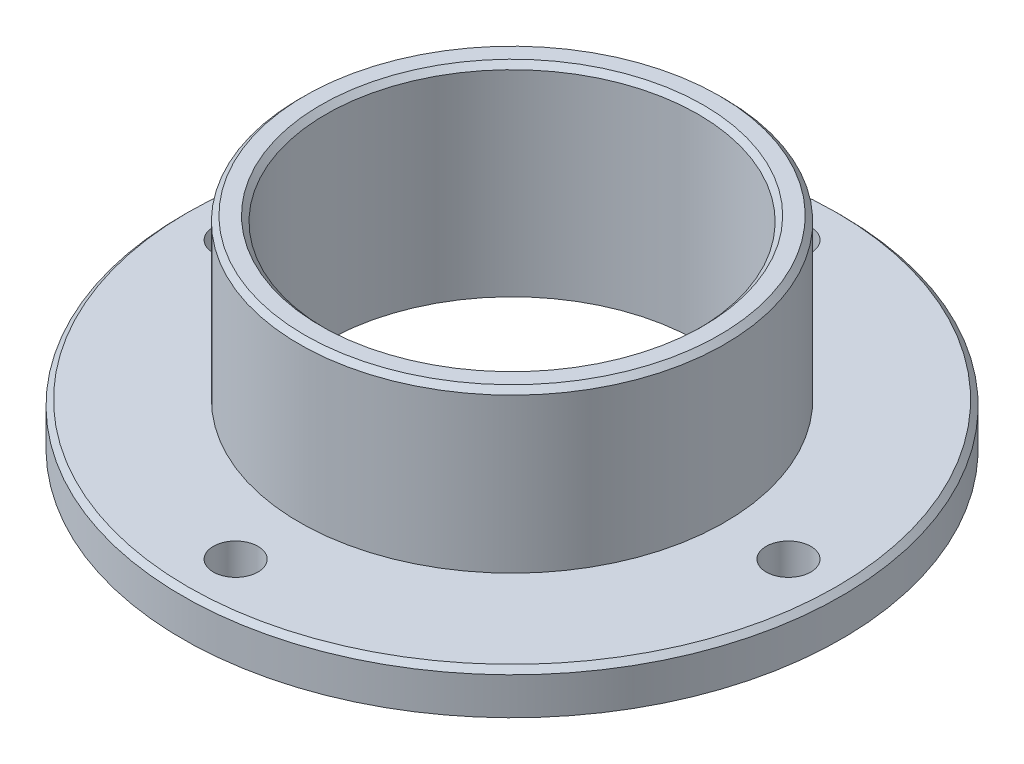
ISO-10303-21;
HEADER;
FILE_DESCRIPTION(('STEP AP214'),'2;1');
FILE_NAME('part.step','',(''),(''),'','','');
FILE_SCHEMA(('AUTOMOTIVE_DESIGN { 1 0 10303 214 1 1 1 1 }'));
ENDSEC;
DATA;
#1=APPLICATION_CONTEXT('core data for automotive mechanical design processes');
#2=APPLICATION_PROTOCOL_DEFINITION('international standard','automotive_design',2000,#1);
#3=PRODUCT_CONTEXT('',#1,'mechanical');
#4=PRODUCT('Part','Part','',(#3));
#5=PRODUCT_RELATED_PRODUCT_CATEGORY('part','',(#4));
#6=PRODUCT_DEFINITION_FORMATION('','',#4);
#7=PRODUCT_DEFINITION_CONTEXT('part definition',#1,'design');
#8=PRODUCT_DEFINITION('design','',#6,#7);
#9=PRODUCT_DEFINITION_SHAPE('','',#8);
#10=(LENGTH_UNIT() NAMED_UNIT(*) SI_UNIT(.MILLI.,.METRE.));
#11=(NAMED_UNIT(*) PLANE_ANGLE_UNIT() SI_UNIT($,.RADIAN.));
#12=(NAMED_UNIT(*) SI_UNIT($,.STERADIAN.) SOLID_ANGLE_UNIT());
#13=UNCERTAINTY_MEASURE_WITH_UNIT(LENGTH_MEASURE(1.E-05),#10,'distance_accuracy_value','');
#14=(GEOMETRIC_REPRESENTATION_CONTEXT(3) GLOBAL_UNCERTAINTY_ASSIGNED_CONTEXT((#13)) GLOBAL_UNIT_ASSIGNED_CONTEXT((#10,
#11,#12)) REPRESENTATION_CONTEXT('',''));
#15=CARTESIAN_POINT('',(0.,0.,0.));
#16=DIRECTION('',(0.,0.,1.));
#17=DIRECTION('',(1.,0.,0.));
#18=AXIS2_PLACEMENT_3D('',#15,#16,#17);
#19=CARTESIAN_POINT('',(0.,0.,0.));
#20=DIRECTION('',(0.,-1.,0.));
#21=DIRECTION('',(0.,0.,-1.));
#22=AXIS2_PLACEMENT_3D('',#19,#20,#21);
#23=CYLINDRICAL_SURFACE('',#22,31.);
#24=CARTESIAN_POINT('',(0.,3.50000000000001,0.));
#25=DIRECTION('',(0.,-1.,0.));
#26=DIRECTION('',(0.,0.,-1.));
#27=AXIS2_PLACEMENT_3D('',#24,#25,#26);
#28=CIRCLE('',#27,31.);
#29=CARTESIAN_POINT('',(0.,3.50000000000001,-31.));
#30=VERTEX_POINT('',#29);
#31=EDGE_CURVE('E44',#30,#30,#28,.T.);
#32=ORIENTED_EDGE('',*,*,#31,.T.);
#33=EDGE_LOOP('',(#32));
#34=FACE_BOUND('',#33,.T.);
#35=CARTESIAN_POINT('',(0.,0.,0.));
#36=DIRECTION('',(0.,-1.,0.));
#37=DIRECTION('',(0.,0.,-1.));
#38=AXIS2_PLACEMENT_3D('',#35,#36,#37);
#39=CIRCLE('',#38,31.);
#40=CARTESIAN_POINT('',(0.,0.,-31.));
#41=VERTEX_POINT('',#40);
#42=EDGE_CURVE('E63',#41,#41,#39,.T.);
#43=ORIENTED_EDGE('',*,*,#42,.F.);
#44=EDGE_LOOP('',(#43));
#45=FACE_BOUND('',#44,.T.);
#46=ADVANCED_FACE('F36',(#34,#45),#23,.T.);
#47=CARTESIAN_POINT('',(-31.,0.,0.));
#48=DIRECTION('',(0.,1.,0.));
#49=DIRECTION('',(0.,0.,1.));
#50=AXIS2_PLACEMENT_3D('',#47,#48,#49);
#51=PLANE('',#50);
#52=CARTESIAN_POINT('',(-26.,0.,-2.72335544429764E-13));
#53=DIRECTION('',(0.,1.,0.));
#54=DIRECTION('',(0.,0.,1.));
#55=AXIS2_PLACEMENT_3D('',#52,#53,#54);
#56=CIRCLE('',#55,2.1);
#57=CARTESIAN_POINT('',(-26.,0.,2.09999999999973));
#58=VERTEX_POINT('',#57);
#59=EDGE_CURVE('E90',#58,#58,#56,.T.);
#60=ORIENTED_EDGE('',*,*,#59,.T.);
#61=EDGE_LOOP('',(#60));
#62=FACE_BOUND('',#61,.T.);
#63=CARTESIAN_POINT('',(0.,0.,26.));
#64=DIRECTION('',(0.,1.,0.));
#65=DIRECTION('',(0.,0.,1.));
#66=AXIS2_PLACEMENT_3D('',#63,#64,#65);
#67=CIRCLE('',#66,2.1);
#68=CARTESIAN_POINT('',(0.,0.,28.1));
#69=VERTEX_POINT('',#68);
#70=EDGE_CURVE('E84',#69,#69,#67,.T.);
#71=ORIENTED_EDGE('',*,*,#70,.T.);
#72=EDGE_LOOP('',(#71));
#73=FACE_BOUND('',#72,.T.);
#74=CARTESIAN_POINT('',(26.,0.,0.));
#75=DIRECTION('',(0.,1.,0.));
#76=DIRECTION('',(0.,0.,1.));
#77=AXIS2_PLACEMENT_3D('',#74,#75,#76);
#78=CIRCLE('',#77,2.1);
#79=CARTESIAN_POINT('',(26.,0.,2.10000000000009));
#80=VERTEX_POINT('',#79);
#81=EDGE_CURVE('E78',#80,#80,#78,.T.);
#82=ORIENTED_EDGE('',*,*,#81,.T.);
#83=EDGE_LOOP('',(#82));
#84=FACE_BOUND('',#83,.T.);
#85=CARTESIAN_POINT('',(0.,0.,-26.));
#86=DIRECTION('',(0.,1.,0.));
#87=DIRECTION('',(0.,0.,1.));
#88=AXIS2_PLACEMENT_3D('',#85,#86,#87);
#89=CIRCLE('',#88,2.1);
#90=CARTESIAN_POINT('',(0.,0.,-23.9));
#91=VERTEX_POINT('',#90);
#92=EDGE_CURVE('E72',#91,#91,#89,.T.);
#93=ORIENTED_EDGE('',*,*,#92,.T.);
#94=EDGE_LOOP('',(#93));
#95=FACE_BOUND('',#94,.T.);
#96=CARTESIAN_POINT('',(0.,0.,0.));
#97=DIRECTION('',(0.,-1.,0.));
#98=DIRECTION('',(0.,0.,-1.));
#99=AXIS2_PLACEMENT_3D('',#96,#97,#98);
#100=CIRCLE('',#99,17.5);
#101=CARTESIAN_POINT('',(0.,0.,-17.5));
#102=VERTEX_POINT('',#101);
#103=EDGE_CURVE('E66',#102,#102,#100,.T.);
#104=ORIENTED_EDGE('',*,*,#103,.F.);
#105=EDGE_LOOP('',(#104));
#106=FACE_BOUND('',#105,.T.);
#107=ORIENTED_EDGE('',*,*,#42,.T.);
#108=EDGE_LOOP('',(#107));
#109=FACE_BOUND('',#108,.T.);
#110=ADVANCED_FACE('F124',(#62,#73,#84,#95,#106,#109),#51,.F.);
#111=CARTESIAN_POINT('',(0.,0.,0.));
#112=DIRECTION('',(0.,-1.,0.));
#113=DIRECTION('',(0.,0.,-1.));
#114=AXIS2_PLACEMENT_3D('',#111,#112,#113);
#115=CYLINDRICAL_SURFACE('',#114,17.5);
#116=CARTESIAN_POINT('',(0.,18.5,0.));
#117=DIRECTION('',(0.,-1.,0.));
#118=DIRECTION('',(0.,0.,-1.));
#119=AXIS2_PLACEMENT_3D('',#116,#117,#118);
#120=CIRCLE('',#119,17.5);
#121=CARTESIAN_POINT('',(0.,18.5,-17.5));
#122=VERTEX_POINT('',#121);
#123=EDGE_CURVE('E52',#122,#122,#120,.F.);
#124=ORIENTED_EDGE('',*,*,#123,.T.);
#125=EDGE_LOOP('',(#124));
#126=FACE_BOUND('',#125,.T.);
#127=ORIENTED_EDGE('',*,*,#103,.T.);
#128=EDGE_LOOP('',(#127));
#129=FACE_BOUND('',#128,.T.);
#130=ADVANCED_FACE('F120',(#126,#129),#115,.F.);
#131=CARTESIAN_POINT('',(-17.5,19.,0.));
#132=DIRECTION('',(0.,-1.,0.));
#133=DIRECTION('',(0.,0.,-1.));
#134=AXIS2_PLACEMENT_3D('',#131,#132,#133);
#135=PLANE('',#134);
#136=CARTESIAN_POINT('',(0.,19.,0.));
#137=DIRECTION('',(0.,-1.,0.));
#138=DIRECTION('',(0.,0.,-1.));
#139=AXIS2_PLACEMENT_3D('',#136,#137,#138);
#140=CIRCLE('',#139,18.);
#141=CARTESIAN_POINT('',(0.,19.,-18.));
#142=VERTEX_POINT('',#141);
#143=EDGE_CURVE('E57',#142,#142,#140,.T.);
#144=ORIENTED_EDGE('',*,*,#143,.T.);
#145=EDGE_LOOP('',(#144));
#146=FACE_BOUND('',#145,.T.);
#147=CARTESIAN_POINT('',(0.,19.,0.));
#148=DIRECTION('',(0.,-1.,0.));
#149=DIRECTION('',(0.,0.,-1.));
#150=AXIS2_PLACEMENT_3D('',#147,#148,#149);
#151=CIRCLE('',#150,19.5);
#152=CARTESIAN_POINT('',(0.,19.,-19.5));
#153=VERTEX_POINT('',#152);
#154=EDGE_CURVE('E60',#153,#153,#151,.F.);
#155=ORIENTED_EDGE('',*,*,#154,.T.);
#156=EDGE_LOOP('',(#155));
#157=FACE_BOUND('',#156,.T.);
#158=ADVANCED_FACE('F114',(#146,#157),#135,.F.);
#159=CARTESIAN_POINT('',(0.,0.,0.));
#160=DIRECTION('',(0.,-1.,0.));
#161=DIRECTION('',(0.,0.,-1.));
#162=AXIS2_PLACEMENT_3D('',#159,#160,#161);
#163=CYLINDRICAL_SURFACE('',#162,20.);
#164=CARTESIAN_POINT('',(0.,18.5,0.));
#165=DIRECTION('',(0.,-1.,0.));
#166=DIRECTION('',(0.,0.,-1.));
#167=AXIS2_PLACEMENT_3D('',#164,#165,#166);
#168=CIRCLE('',#167,20.);
#169=CARTESIAN_POINT('',(0.,18.5,-20.));
#170=VERTEX_POINT('',#169);
#171=EDGE_CURVE('E48',#170,#170,#168,.T.);
#172=ORIENTED_EDGE('',*,*,#171,.T.);
#173=EDGE_LOOP('',(#172));
#174=FACE_BOUND('',#173,.T.);
#175=CARTESIAN_POINT('',(0.,4.,0.));
#176=DIRECTION('',(0.,-1.,0.));
#177=DIRECTION('',(0.,0.,-1.));
#178=AXIS2_PLACEMENT_3D('',#175,#176,#177);
#179=CIRCLE('',#178,20.);
#180=CARTESIAN_POINT('',(0.,4.,-20.));
#181=VERTEX_POINT('',#180);
#182=EDGE_CURVE('E69',#181,#181,#179,.T.);
#183=ORIENTED_EDGE('',*,*,#182,.F.);
#184=EDGE_LOOP('',(#183));
#185=FACE_BOUND('',#184,.T.);
#186=ADVANCED_FACE('F103',(#174,#185),#163,.T.);
#187=CARTESIAN_POINT('',(-20.,4.,0.));
#188=DIRECTION('',(0.,-1.,0.));
#189=DIRECTION('',(0.,0.,-1.));
#190=AXIS2_PLACEMENT_3D('',#187,#188,#189);
#191=PLANE('',#190);
#192=CARTESIAN_POINT('',(0.,4.,0.));
#193=DIRECTION('',(0.,-1.,0.));
#194=DIRECTION('',(0.,0.,-1.));
#195=AXIS2_PLACEMENT_3D('',#192,#193,#194);
#196=CIRCLE('',#195,30.5);
#197=CARTESIAN_POINT('',(0.,4.,-30.5));
#198=VERTEX_POINT('',#197);
#199=EDGE_CURVE('E10',#198,#198,#196,.F.);
#200=ORIENTED_EDGE('',*,*,#199,.T.);
#201=EDGE_LOOP('',(#200));
#202=FACE_BOUND('',#201,.T.);
#203=CARTESIAN_POINT('',(-26.,4.,-2.72335544429764E-13));
#204=DIRECTION('',(0.,1.,0.));
#205=DIRECTION('',(0.,0.,1.));
#206=AXIS2_PLACEMENT_3D('',#203,#204,#205);
#207=CIRCLE('',#206,2.09999999999999);
#208=CARTESIAN_POINT('',(-26.,4.,2.09999999999971));
#209=VERTEX_POINT('',#208);
#210=EDGE_CURVE('E93',#209,#209,#207,.T.);
#211=ORIENTED_EDGE('',*,*,#210,.F.);
#212=EDGE_LOOP('',(#211));
#213=FACE_BOUND('',#212,.T.);
#214=CARTESIAN_POINT('',(0.,4.,26.));
#215=DIRECTION('',(0.,1.,0.));
#216=DIRECTION('',(0.,0.,1.));
#217=AXIS2_PLACEMENT_3D('',#214,#215,#216);
#218=CIRCLE('',#217,2.09999999999999);
#219=CARTESIAN_POINT('',(0.,4.,28.1));
#220=VERTEX_POINT('',#219);
#221=EDGE_CURVE('E87',#220,#220,#218,.T.);
#222=ORIENTED_EDGE('',*,*,#221,.F.);
#223=EDGE_LOOP('',(#222));
#224=FACE_BOUND('',#223,.T.);
#225=CARTESIAN_POINT('',(26.,4.,0.));
#226=DIRECTION('',(0.,1.,0.));
#227=DIRECTION('',(0.,0.,1.));
#228=AXIS2_PLACEMENT_3D('',#225,#226,#227);
#229=CIRCLE('',#228,2.09999999999999);
#230=CARTESIAN_POINT('',(26.,4.,2.10000000000008));
#231=VERTEX_POINT('',#230);
#232=EDGE_CURVE('E81',#231,#231,#229,.T.);
#233=ORIENTED_EDGE('',*,*,#232,.F.);
#234=EDGE_LOOP('',(#233));
#235=FACE_BOUND('',#234,.T.);
#236=CARTESIAN_POINT('',(0.,4.,-26.));
#237=DIRECTION('',(0.,1.,0.));
#238=DIRECTION('',(0.,0.,1.));
#239=AXIS2_PLACEMENT_3D('',#236,#237,#238);
#240=CIRCLE('',#239,2.09999999999999);
#241=CARTESIAN_POINT('',(0.,4.,-23.9));
#242=VERTEX_POINT('',#241);
#243=EDGE_CURVE('E75',#242,#242,#240,.T.);
#244=ORIENTED_EDGE('',*,*,#243,.F.);
#245=EDGE_LOOP('',(#244));
#246=FACE_BOUND('',#245,.T.);
#247=ORIENTED_EDGE('',*,*,#182,.T.);
#248=EDGE_LOOP('',(#247));
#249=FACE_BOUND('',#248,.T.);
#250=ADVANCED_FACE('F99',(#202,#213,#224,#235,#246,#249),#191,.F.);
#251=CARTESIAN_POINT('',(0.,4.,-26.));
#252=DIRECTION('',(0.,1.,0.));
#253=DIRECTION('',(0.,0.,1.));
#254=AXIS2_PLACEMENT_3D('',#251,#252,#253);
#255=CYLINDRICAL_SURFACE('',#254,2.09999999999999);
#256=ORIENTED_EDGE('',*,*,#92,.F.);
#257=EDGE_LOOP('',(#256));
#258=FACE_BOUND('',#257,.T.);
#259=ORIENTED_EDGE('',*,*,#243,.T.);
#260=EDGE_LOOP('',(#259));
#261=FACE_BOUND('',#260,.T.);
#262=ADVANCED_FACE('F102',(#258,#261),#255,.F.);
#263=CARTESIAN_POINT('',(26.,4.,0.));
#264=DIRECTION('',(0.,1.,0.));
#265=DIRECTION('',(0.,0.,1.));
#266=AXIS2_PLACEMENT_3D('',#263,#264,#265);
#267=CYLINDRICAL_SURFACE('',#266,2.09999999999999);
#268=ORIENTED_EDGE('',*,*,#81,.F.);
#269=EDGE_LOOP('',(#268));
#270=FACE_BOUND('',#269,.T.);
#271=ORIENTED_EDGE('',*,*,#232,.T.);
#272=EDGE_LOOP('',(#271));
#273=FACE_BOUND('',#272,.T.);
#274=ADVANCED_FACE('F190',(#270,#273),#267,.F.);
#275=CARTESIAN_POINT('',(0.,4.,26.));
#276=DIRECTION('',(0.,1.,0.));
#277=DIRECTION('',(0.,0.,1.));
#278=AXIS2_PLACEMENT_3D('',#275,#276,#277);
#279=CYLINDRICAL_SURFACE('',#278,2.09999999999999);
#280=ORIENTED_EDGE('',*,*,#70,.F.);
#281=EDGE_LOOP('',(#280));
#282=FACE_BOUND('',#281,.T.);
#283=ORIENTED_EDGE('',*,*,#221,.T.);
#284=EDGE_LOOP('',(#283));
#285=FACE_BOUND('',#284,.T.);
#286=ADVANCED_FACE('F179',(#282,#285),#279,.F.);
#287=CARTESIAN_POINT('',(-26.,4.,-2.72335544429764E-13));
#288=DIRECTION('',(0.,1.,0.));
#289=DIRECTION('',(0.,0.,1.));
#290=AXIS2_PLACEMENT_3D('',#287,#288,#289);
#291=CYLINDRICAL_SURFACE('',#290,2.09999999999999);
#292=ORIENTED_EDGE('',*,*,#59,.F.);
#293=EDGE_LOOP('',(#292));
#294=FACE_BOUND('',#293,.T.);
#295=ORIENTED_EDGE('',*,*,#210,.T.);
#296=EDGE_LOOP('',(#295));
#297=FACE_BOUND('',#296,.T.);
#298=ADVANCED_FACE('F97',(#294,#297),#291,.F.);
#299=CARTESIAN_POINT('',(0.,19.,0.));
#300=DIRECTION('',(0.,1.,0.));
#301=DIRECTION('',(0.,0.,1.));
#302=AXIS2_PLACEMENT_3D('',#299,#300,#301);
#303=CONICAL_SURFACE('',#302,18.,0.785398163397435);
#304=ORIENTED_EDGE('',*,*,#123,.F.);
#305=EDGE_LOOP('',(#304));
#306=FACE_BOUND('',#305,.T.);
#307=ORIENTED_EDGE('',*,*,#143,.F.);
#308=EDGE_LOOP('',(#307));
#309=FACE_BOUND('',#308,.T.);
#310=ADVANCED_FACE('F135',(#306,#309),#303,.F.);
#311=CARTESIAN_POINT('',(0.,18.5,0.));
#312=DIRECTION('',(0.,-1.,0.));
#313=DIRECTION('',(0.,0.,-1.));
#314=AXIS2_PLACEMENT_3D('',#311,#312,#313);
#315=CONICAL_SURFACE('',#314,20.,0.785398163397462);
#316=ORIENTED_EDGE('',*,*,#154,.F.);
#317=EDGE_LOOP('',(#316));
#318=FACE_BOUND('',#317,.T.);
#319=ORIENTED_EDGE('',*,*,#171,.F.);
#320=EDGE_LOOP('',(#319));
#321=FACE_BOUND('',#320,.T.);
#322=ADVANCED_FACE('F140',(#318,#321),#315,.T.);
#323=CARTESIAN_POINT('',(0.,3.50000000000001,0.));
#324=DIRECTION('',(0.,-1.,0.));
#325=DIRECTION('',(0.,0.,-1.));
#326=AXIS2_PLACEMENT_3D('',#323,#324,#325);
#327=CONICAL_SURFACE('',#326,31.,0.785398163397445);
#328=ORIENTED_EDGE('',*,*,#199,.F.);
#329=EDGE_LOOP('',(#328));
#330=FACE_BOUND('',#329,.T.);
#331=ORIENTED_EDGE('',*,*,#31,.F.);
#332=EDGE_LOOP('',(#331));
#333=FACE_BOUND('',#332,.T.);
#334=ADVANCED_FACE('F39',(#330,#333),#327,.T.);
#335=CLOSED_SHELL('',(#46,#110,#130,#158,#186,#250,#262,#274,#286,#298,#310,#322,#334));
#336=MANIFOLD_SOLID_BREP('B2',#335);
#337=ADVANCED_BREP_SHAPE_REPRESENTATION('',(#18,#336),#14);
#338=SHAPE_DEFINITION_REPRESENTATION(#9,#337);
ENDSEC;
END-ISO-10303-21;
